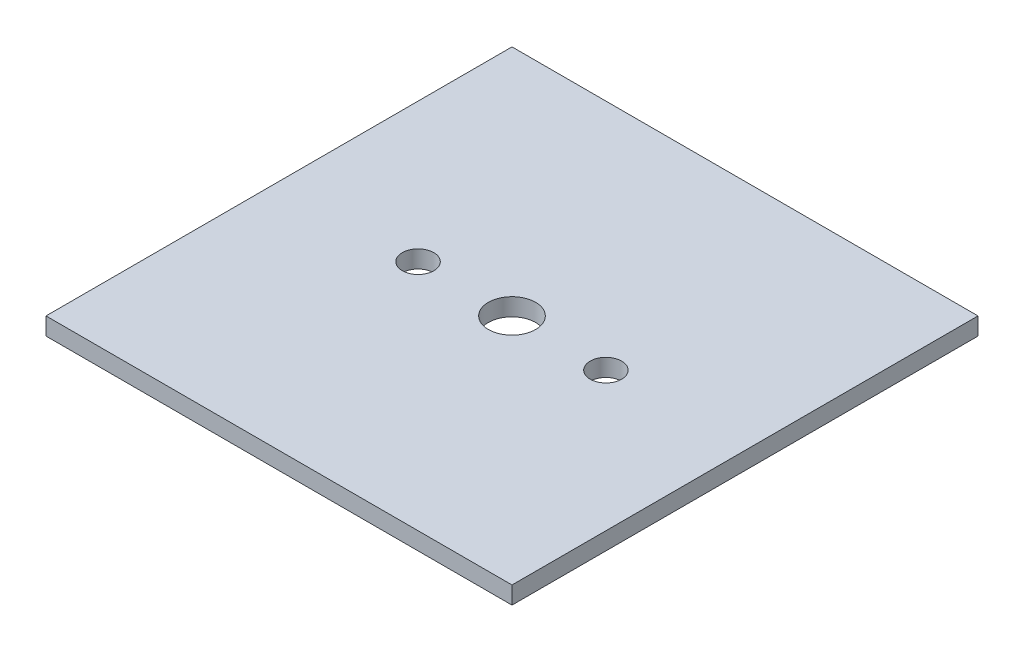
ISO-10303-21;
HEADER;
FILE_DESCRIPTION(('STEP AP214'),'2;1');
FILE_NAME('part.step','',(''),(''),'','','');
FILE_SCHEMA(('AUTOMOTIVE_DESIGN { 1 0 10303 214 1 1 1 1 }'));
ENDSEC;
DATA;
#1=APPLICATION_CONTEXT('core data for automotive mechanical design processes');
#2=APPLICATION_PROTOCOL_DEFINITION('international standard','automotive_design',2000,#1);
#3=PRODUCT_CONTEXT('',#1,'mechanical');
#4=PRODUCT('Part','Part','',(#3));
#5=PRODUCT_RELATED_PRODUCT_CATEGORY('part','',(#4));
#6=PRODUCT_DEFINITION_FORMATION('','',#4);
#7=PRODUCT_DEFINITION_CONTEXT('part definition',#1,'design');
#8=PRODUCT_DEFINITION('design','',#6,#7);
#9=PRODUCT_DEFINITION_SHAPE('','',#8);
#10=(LENGTH_UNIT() NAMED_UNIT(*) SI_UNIT(.MILLI.,.METRE.));
#11=(NAMED_UNIT(*) PLANE_ANGLE_UNIT() SI_UNIT($,.RADIAN.));
#12=(NAMED_UNIT(*) SI_UNIT($,.STERADIAN.) SOLID_ANGLE_UNIT());
#13=UNCERTAINTY_MEASURE_WITH_UNIT(LENGTH_MEASURE(1.E-05),#10,'distance_accuracy_value','');
#14=(GEOMETRIC_REPRESENTATION_CONTEXT(3) GLOBAL_UNCERTAINTY_ASSIGNED_CONTEXT((#13)) GLOBAL_UNIT_ASSIGNED_CONTEXT((#10,
#11,#12)) REPRESENTATION_CONTEXT('',''));
#15=CARTESIAN_POINT('',(0.,0.,0.));
#16=DIRECTION('',(0.,0.,1.));
#17=DIRECTION('',(1.,0.,0.));
#18=AXIS2_PLACEMENT_3D('',#15,#16,#17);
#19=CARTESIAN_POINT('',(40.,3.,40.));
#20=DIRECTION('',(-1.,0.,0.));
#21=DIRECTION('',(0.,0.,1.));
#22=AXIS2_PLACEMENT_3D('',#19,#20,#21);
#23=PLANE('',#22);
#24=DIRECTION('',(0.,0.,-1.));
#25=VECTOR('',#24,1.);
#26=CARTESIAN_POINT('',(40.,0.,40.));
#27=LINE('',#26,#25);
#28=CARTESIAN_POINT('',(40.,0.,40.));
#29=VERTEX_POINT('',#28);
#30=CARTESIAN_POINT('',(40.,0.,-40.));
#31=VERTEX_POINT('',#30);
#32=EDGE_CURVE('E114',#29,#31,#27,.T.);
#33=ORIENTED_EDGE('',*,*,#32,.T.);
#34=DIRECTION('',(0.,-1.,0.));
#35=VECTOR('',#34,1.);
#36=CARTESIAN_POINT('',(40.,3.,-40.));
#37=LINE('',#36,#35);
#38=CARTESIAN_POINT('',(40.,3.,-40.));
#39=VERTEX_POINT('',#38);
#40=EDGE_CURVE('E11',#39,#31,#37,.T.);
#41=ORIENTED_EDGE('',*,*,#40,.F.);
#42=DIRECTION('',(0.,0.,-1.));
#43=VECTOR('',#42,1.);
#44=CARTESIAN_POINT('',(40.,3.,40.));
#45=LINE('',#44,#43);
#46=CARTESIAN_POINT('',(40.,3.,40.));
#47=VERTEX_POINT('',#46);
#48=EDGE_CURVE('E100',#47,#39,#45,.T.);
#49=ORIENTED_EDGE('',*,*,#48,.F.);
#50=DIRECTION('',(0.,-1.,0.));
#51=VECTOR('',#50,1.);
#52=CARTESIAN_POINT('',(40.,3.,40.));
#53=LINE('',#52,#51);
#54=EDGE_CURVE('E108',#47,#29,#53,.T.);
#55=ORIENTED_EDGE('',*,*,#54,.T.);
#56=EDGE_LOOP('',(#33,#41,#49,#55));
#57=FACE_BOUND('',#56,.T.);
#58=ADVANCED_FACE('F44',(#57),#23,.F.);
#59=CARTESIAN_POINT('',(-40.,3.,-40.));
#60=DIRECTION('',(0.,0.,1.));
#61=DIRECTION('',(1.,0.,0.));
#62=AXIS2_PLACEMENT_3D('',#59,#60,#61);
#63=PLANE('',#62);
#64=DIRECTION('',(-1.,0.,0.));
#65=VECTOR('',#64,1.);
#66=CARTESIAN_POINT('',(-40.,0.,-40.));
#67=LINE('',#66,#65);
#68=CARTESIAN_POINT('',(-40.,0.,-40.));
#69=VERTEX_POINT('',#68);
#70=EDGE_CURVE('E105',#31,#69,#67,.T.);
#71=ORIENTED_EDGE('',*,*,#70,.T.);
#72=DIRECTION('',(0.,-1.,0.));
#73=VECTOR('',#72,1.);
#74=CARTESIAN_POINT('',(-40.,3.,-40.));
#75=LINE('',#74,#73);
#76=CARTESIAN_POINT('',(-40.,3.,-40.));
#77=VERTEX_POINT('',#76);
#78=EDGE_CURVE('E53',#77,#69,#75,.T.);
#79=ORIENTED_EDGE('',*,*,#78,.F.);
#80=DIRECTION('',(-1.,0.,0.));
#81=VECTOR('',#80,1.);
#82=CARTESIAN_POINT('',(-40.,3.,-40.));
#83=LINE('',#82,#81);
#84=EDGE_CURVE('E95',#39,#77,#83,.T.);
#85=ORIENTED_EDGE('',*,*,#84,.F.);
#86=ORIENTED_EDGE('',*,*,#40,.T.);
#87=EDGE_LOOP('',(#71,#79,#85,#86));
#88=FACE_BOUND('',#87,.T.);
#89=ADVANCED_FACE('F101',(#88),#63,.F.);
#90=CARTESIAN_POINT('',(-40.,3.,40.));
#91=DIRECTION('',(1.,0.,0.));
#92=DIRECTION('',(0.,0.,-1.));
#93=AXIS2_PLACEMENT_3D('',#90,#91,#92);
#94=PLANE('',#93);
#95=DIRECTION('',(0.,0.,1.));
#96=VECTOR('',#95,1.);
#97=CARTESIAN_POINT('',(-40.,0.,40.));
#98=LINE('',#97,#96);
#99=CARTESIAN_POINT('',(-40.,0.,40.));
#100=VERTEX_POINT('',#99);
#101=EDGE_CURVE('E76',#69,#100,#98,.T.);
#102=ORIENTED_EDGE('',*,*,#101,.T.);
#103=DIRECTION('',(0.,-1.,0.));
#104=VECTOR('',#103,1.);
#105=CARTESIAN_POINT('',(-40.,3.,40.));
#106=LINE('',#105,#104);
#107=CARTESIAN_POINT('',(-40.,3.,40.));
#108=VERTEX_POINT('',#107);
#109=EDGE_CURVE('E102',#108,#100,#106,.T.);
#110=ORIENTED_EDGE('',*,*,#109,.F.);
#111=DIRECTION('',(0.,0.,1.));
#112=VECTOR('',#111,1.);
#113=CARTESIAN_POINT('',(-40.,3.,40.));
#114=LINE('',#113,#112);
#115=EDGE_CURVE('E92',#77,#108,#114,.T.);
#116=ORIENTED_EDGE('',*,*,#115,.F.);
#117=ORIENTED_EDGE('',*,*,#78,.T.);
#118=EDGE_LOOP('',(#102,#110,#116,#117));
#119=FACE_BOUND('',#118,.T.);
#120=ADVANCED_FACE('F104',(#119),#94,.F.);
#121=CARTESIAN_POINT('',(-40.,3.,40.));
#122=DIRECTION('',(0.,0.,-1.));
#123=DIRECTION('',(-1.,0.,0.));
#124=AXIS2_PLACEMENT_3D('',#121,#122,#123);
#125=PLANE('',#124);
#126=DIRECTION('',(1.,0.,0.));
#127=VECTOR('',#126,1.);
#128=CARTESIAN_POINT('',(-40.,0.,40.));
#129=LINE('',#128,#127);
#130=EDGE_CURVE('E83',#100,#29,#129,.T.);
#131=ORIENTED_EDGE('',*,*,#130,.T.);
#132=ORIENTED_EDGE('',*,*,#54,.F.);
#133=DIRECTION('',(1.,0.,0.));
#134=VECTOR('',#133,1.);
#135=CARTESIAN_POINT('',(-40.,3.,40.));
#136=LINE('',#135,#134);
#137=EDGE_CURVE('E65',#108,#47,#136,.T.);
#138=ORIENTED_EDGE('',*,*,#137,.F.);
#139=ORIENTED_EDGE('',*,*,#109,.T.);
#140=EDGE_LOOP('',(#131,#132,#138,#139));
#141=FACE_BOUND('',#140,.T.);
#142=ADVANCED_FACE('F130',(#141),#125,.F.);
#143=CARTESIAN_POINT('',(0.,3.,0.));
#144=DIRECTION('',(0.,-1.,0.));
#145=DIRECTION('',(0.,0.,-1.));
#146=AXIS2_PLACEMENT_3D('',#143,#144,#145);
#147=PLANE('',#146);
#148=CARTESIAN_POINT('',(16.125,3.,0.));
#149=DIRECTION('',(0.,1.,0.));
#150=DIRECTION('',(0.,0.,1.));
#151=AXIS2_PLACEMENT_3D('',#148,#149,#150);
#152=CIRCLE('',#151,2.7);
#153=CARTESIAN_POINT('',(16.125,3.,2.7));
#154=VERTEX_POINT('',#153);
#155=EDGE_CURVE('E147',#154,#154,#152,.T.);
#156=ORIENTED_EDGE('',*,*,#155,.F.);
#157=EDGE_LOOP('',(#156));
#158=FACE_BOUND('',#157,.T.);
#159=CARTESIAN_POINT('',(-16.125,3.,0.));
#160=DIRECTION('',(0.,1.,0.));
#161=DIRECTION('',(0.,0.,1.));
#162=AXIS2_PLACEMENT_3D('',#159,#160,#161);
#163=CIRCLE('',#162,2.7);
#164=CARTESIAN_POINT('',(-16.125,3.,2.7));
#165=VERTEX_POINT('',#164);
#166=EDGE_CURVE('E148',#165,#165,#163,.T.);
#167=ORIENTED_EDGE('',*,*,#166,.F.);
#168=EDGE_LOOP('',(#167));
#169=FACE_BOUND('',#168,.T.);
#170=CARTESIAN_POINT('',(0.,3.,0.));
#171=DIRECTION('',(0.,1.,0.));
#172=DIRECTION('',(0.,0.,1.));
#173=AXIS2_PLACEMENT_3D('',#170,#171,#172);
#174=CIRCLE('',#173,4.05);
#175=CARTESIAN_POINT('',(0.,3.,4.05));
#176=VERTEX_POINT('',#175);
#177=EDGE_CURVE('E131',#176,#176,#174,.T.);
#178=ORIENTED_EDGE('',*,*,#177,.F.);
#179=EDGE_LOOP('',(#178));
#180=FACE_BOUND('',#179,.T.);
#181=ORIENTED_EDGE('',*,*,#48,.T.);
#182=ORIENTED_EDGE('',*,*,#84,.T.);
#183=ORIENTED_EDGE('',*,*,#115,.T.);
#184=ORIENTED_EDGE('',*,*,#137,.T.);
#185=EDGE_LOOP('',(#181,#182,#183,#184));
#186=FACE_BOUND('',#185,.T.);
#187=ADVANCED_FACE('F91',(#158,#169,#180,#186),#147,.F.);
#188=CARTESIAN_POINT('',(0.,0.,0.));
#189=DIRECTION('',(0.,-1.,0.));
#190=DIRECTION('',(0.,0.,-1.));
#191=AXIS2_PLACEMENT_3D('',#188,#189,#190);
#192=PLANE('',#191);
#193=CARTESIAN_POINT('',(16.125,0.,0.));
#194=DIRECTION('',(0.,1.,0.));
#195=DIRECTION('',(0.,0.,1.));
#196=AXIS2_PLACEMENT_3D('',#193,#194,#195);
#197=CIRCLE('',#196,2.7);
#198=CARTESIAN_POINT('',(16.125,0.,2.7));
#199=VERTEX_POINT('',#198);
#200=EDGE_CURVE('E139',#199,#199,#197,.T.);
#201=ORIENTED_EDGE('',*,*,#200,.T.);
#202=EDGE_LOOP('',(#201));
#203=FACE_BOUND('',#202,.T.);
#204=CARTESIAN_POINT('',(-16.125,0.,0.));
#205=DIRECTION('',(0.,1.,0.));
#206=DIRECTION('',(0.,0.,1.));
#207=AXIS2_PLACEMENT_3D('',#204,#205,#206);
#208=CIRCLE('',#207,2.7);
#209=CARTESIAN_POINT('',(-16.125,0.,2.7));
#210=VERTEX_POINT('',#209);
#211=EDGE_CURVE('E142',#210,#210,#208,.T.);
#212=ORIENTED_EDGE('',*,*,#211,.T.);
#213=EDGE_LOOP('',(#212));
#214=FACE_BOUND('',#213,.T.);
#215=CARTESIAN_POINT('',(0.,0.,0.));
#216=DIRECTION('',(0.,1.,0.));
#217=DIRECTION('',(0.,0.,1.));
#218=AXIS2_PLACEMENT_3D('',#215,#216,#217);
#219=CIRCLE('',#218,4.05);
#220=CARTESIAN_POINT('',(0.,0.,4.05));
#221=VERTEX_POINT('',#220);
#222=EDGE_CURVE('E120',#221,#221,#219,.T.);
#223=ORIENTED_EDGE('',*,*,#222,.T.);
#224=EDGE_LOOP('',(#223));
#225=FACE_BOUND('',#224,.T.);
#226=ORIENTED_EDGE('',*,*,#32,.F.);
#227=ORIENTED_EDGE('',*,*,#130,.F.);
#228=ORIENTED_EDGE('',*,*,#101,.F.);
#229=ORIENTED_EDGE('',*,*,#70,.F.);
#230=EDGE_LOOP('',(#226,#227,#228,#229));
#231=FACE_BOUND('',#230,.T.);
#232=ADVANCED_FACE('F128',(#203,#214,#225,#231),#192,.T.);
#233=CARTESIAN_POINT('',(0.,0.,0.));
#234=DIRECTION('',(0.,1.,0.));
#235=DIRECTION('',(0.,0.,1.));
#236=AXIS2_PLACEMENT_3D('',#233,#234,#235);
#237=CYLINDRICAL_SURFACE('',#236,4.05);
#238=ORIENTED_EDGE('',*,*,#222,.F.);
#239=EDGE_LOOP('',(#238));
#240=FACE_BOUND('',#239,.T.);
#241=ORIENTED_EDGE('',*,*,#177,.T.);
#242=EDGE_LOOP('',(#241));
#243=FACE_BOUND('',#242,.T.);
#244=ADVANCED_FACE('F171',(#240,#243),#237,.F.);
#245=CARTESIAN_POINT('',(-16.125,0.,0.));
#246=DIRECTION('',(0.,1.,0.));
#247=DIRECTION('',(0.,0.,1.));
#248=AXIS2_PLACEMENT_3D('',#245,#246,#247);
#249=CYLINDRICAL_SURFACE('',#248,2.7);
#250=ORIENTED_EDGE('',*,*,#211,.F.);
#251=EDGE_LOOP('',(#250));
#252=FACE_BOUND('',#251,.T.);
#253=ORIENTED_EDGE('',*,*,#166,.T.);
#254=EDGE_LOOP('',(#253));
#255=FACE_BOUND('',#254,.T.);
#256=ADVANCED_FACE('F162',(#252,#255),#249,.F.);
#257=CARTESIAN_POINT('',(16.125,0.,0.));
#258=DIRECTION('',(0.,1.,0.));
#259=DIRECTION('',(0.,0.,1.));
#260=AXIS2_PLACEMENT_3D('',#257,#258,#259);
#261=CYLINDRICAL_SURFACE('',#260,2.7);
#262=ORIENTED_EDGE('',*,*,#200,.F.);
#263=EDGE_LOOP('',(#262));
#264=FACE_BOUND('',#263,.T.);
#265=ORIENTED_EDGE('',*,*,#155,.T.);
#266=EDGE_LOOP('',(#265));
#267=FACE_BOUND('',#266,.T.);
#268=ADVANCED_FACE('F159',(#264,#267),#261,.F.);
#269=CLOSED_SHELL('',(#58,#89,#120,#142,#187,#232,#244,#256,#268));
#270=MANIFOLD_SOLID_BREP('B2',#269);
#271=ADVANCED_BREP_SHAPE_REPRESENTATION('',(#18,#270),#14);
#272=SHAPE_DEFINITION_REPRESENTATION(#9,#271);
ENDSEC;
END-ISO-10303-21;
